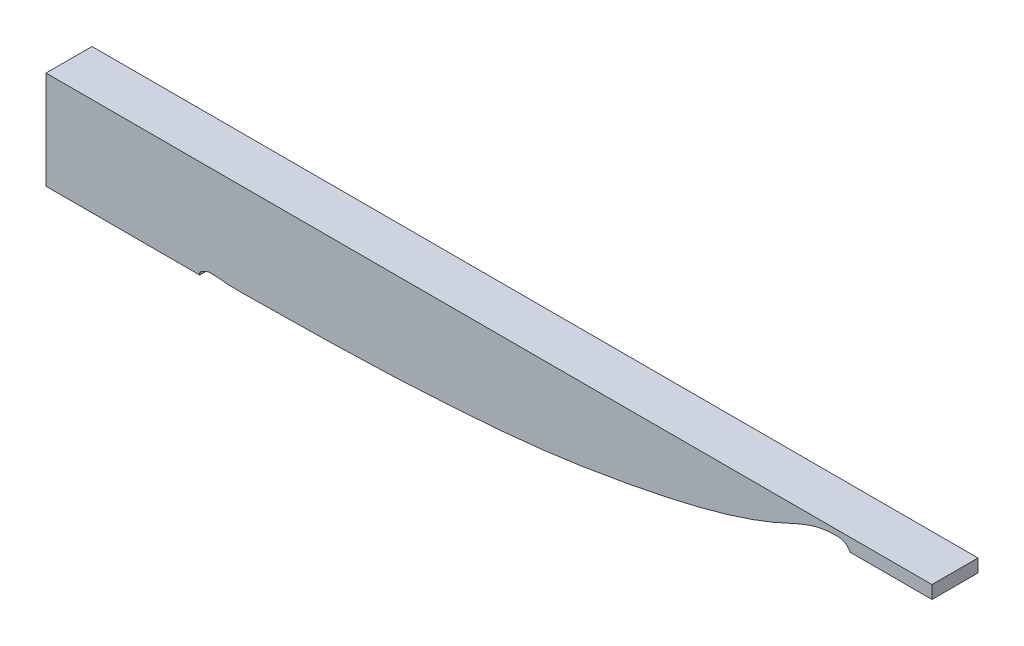
ISO-10303-21;
HEADER;
FILE_DESCRIPTION(('STEP AP214'),'2;1');
FILE_NAME('part.step','',(''),(''),'','','');
FILE_SCHEMA(('AUTOMOTIVE_DESIGN { 1 0 10303 214 1 1 1 1 }'));
ENDSEC;
DATA;
#1=APPLICATION_CONTEXT('core data for automotive mechanical design processes');
#2=APPLICATION_PROTOCOL_DEFINITION('international standard','automotive_design',2000,#1);
#3=PRODUCT_CONTEXT('',#1,'mechanical');
#4=PRODUCT('Part','Part','',(#3));
#5=PRODUCT_RELATED_PRODUCT_CATEGORY('part','',(#4));
#6=PRODUCT_DEFINITION_FORMATION('','',#4);
#7=PRODUCT_DEFINITION_CONTEXT('part definition',#1,'design');
#8=PRODUCT_DEFINITION('design','',#6,#7);
#9=PRODUCT_DEFINITION_SHAPE('','',#8);
#10=(LENGTH_UNIT() NAMED_UNIT(*) SI_UNIT(.MILLI.,.METRE.));
#11=(NAMED_UNIT(*) PLANE_ANGLE_UNIT() SI_UNIT($,.RADIAN.));
#12=(NAMED_UNIT(*) SI_UNIT($,.STERADIAN.) SOLID_ANGLE_UNIT());
#13=UNCERTAINTY_MEASURE_WITH_UNIT(LENGTH_MEASURE(1.E-05),#10,'distance_accuracy_value','');
#14=(GEOMETRIC_REPRESENTATION_CONTEXT(3) GLOBAL_UNCERTAINTY_ASSIGNED_CONTEXT((#13)) GLOBAL_UNIT_ASSIGNED_CONTEXT((#10,
#11,#12)) REPRESENTATION_CONTEXT('',''));
#15=CARTESIAN_POINT('',(0.,0.,0.));
#16=DIRECTION('',(0.,0.,1.));
#17=DIRECTION('',(1.,0.,0.));
#18=AXIS2_PLACEMENT_3D('',#15,#16,#17);
#19=CARTESIAN_POINT('',(-59.657666279957,-14.7983818950778,436.));
#20=CARTESIAN_POINT('',(-59.6661824967044,-14.7225637650633,436.));
#21=CARTESIAN_POINT('',(-59.6731821729966,-14.6464424345209,436.));
#22=CARTESIAN_POINT('',(-59.6562291061453,-14.4951804567944,436.));
#23=CARTESIAN_POINT('',(-59.6324933966375,-14.4212163839659,436.));
#24=CARTESIAN_POINT('',(-59.5533069465011,-14.2890867803336,436.));
#25=CARTESIAN_POINT('',(-59.4977093514819,-14.2360296033315,436.));
#26=CARTESIAN_POINT('',(-59.3753103715163,-14.1440991996391,436.));
#27=CARTESIAN_POINT('',(-59.3113826306846,-14.1019208228015,436.));
#28=CARTESIAN_POINT('',(-59.1206942388301,-13.9740797762433,436.));
#29=CARTESIAN_POINT('',(-58.9901551035155,-13.8949330377344,436.));
#30=CARTESIAN_POINT('',(-58.7177274775307,-13.7568564524608,436.));
#31=CARTESIAN_POINT('',(-58.5743123584874,-13.7003261136001,436.));
#32=CARTESIAN_POINT('',(-58.1387280709696,-13.5812883233373,436.));
#33=CARTESIAN_POINT('',(-57.8357742071376,-13.5583178433627,436.));
#34=CARTESIAN_POINT('',(-57.2291514129619,-13.5563095958595,436.));
#35=CARTESIAN_POINT('',(-56.9271102850682,-13.5760810992746,436.));
#36=CARTESIAN_POINT('',(-56.3238759858096,-13.6294926851283,436.));
#37=CARTESIAN_POINT('',(-56.0226169900578,-13.6632466056831,436.));
#38=CARTESIAN_POINT('',(-55.4197372457623,-13.7180837928467,436.));
#39=CARTESIAN_POINT('',(-55.1182478014107,-13.7399038018808,436.));
#40=CARTESIAN_POINT('',(-54.2136543251735,-13.791230410755,436.));
#41=CARTESIAN_POINT('',(-53.6104181856269,-13.8058170382703,436.));
#42=CARTESIAN_POINT('',(-52.4037421909577,-13.8119830676642,436.));
#43=CARTESIAN_POINT('',(-51.8003273899492,-13.8063920305854,436.));
#44=CARTESIAN_POINT('',(-50.5934932362766,-13.7946959016501,436.));
#45=CARTESIAN_POINT('',(-49.9900781459779,-13.7890721927236,436.));
#46=CARTESIAN_POINT('',(-48.1798020341631,-13.768717954905,436.));
#47=CARTESIAN_POINT('',(-46.972901588441,-13.7505978159146,436.));
#48=CARTESIAN_POINT('',(-43.3522633207156,-13.6951422810275,436.));
#49=CARTESIAN_POINT('',(-40.9385413461733,-13.6551545011908,436.));
#50=CARTESIAN_POINT('',(-36.1114185182662,-13.5592599885742,436.));
#51=CARTESIAN_POINT('',(-33.6979454175016,-13.5022666166358,436.));
#52=CARTESIAN_POINT('',(-26.4601479834471,-13.2754735365616,436.));
#53=CARTESIAN_POINT('',(-21.6385617627188,-13.0426733255743,436.));
#54=CARTESIAN_POINT('',(-14.4107967952092,-12.5892240684821,436.));
#55=CARTESIAN_POINT('',(-12.0025801478201,-12.4238190612903,436.));
#56=CARTESIAN_POINT('',(-7.19109287025892,-12.0422879975373,436.));
#57=CARTESIAN_POINT('',(-4.78783105886261,-11.8246732699985,436.));
#58=CARTESIAN_POINT('',(0.0110709006608093,-11.3069902447495,436.));
#59=CARTESIAN_POINT('',(2.40738262750726,-11.004842687982,436.));
#60=CARTESIAN_POINT('',(7.187183196596,-10.3154339469413,436.));
#61=CARTESIAN_POINT('',(9.57086414618754,-9.93041809446343,436.));
#62=CARTESIAN_POINT('',(14.3287227949183,-9.0996898920714,436.));
#63=CARTESIAN_POINT('',(16.7018448683105,-8.65423955685597,436.));
#64=CARTESIAN_POINT('',(21.4337866944255,-7.6892413541034,436.));
#65=CARTESIAN_POINT('',(23.7930063438113,-7.17165996112708,436.));
#66=CARTESIAN_POINT('',(28.4768234296212,-6.02501208290895,436.));
#67=CARTESIAN_POINT('',(30.8007851018114,-5.3895187024417,436.));
#68=CARTESIAN_POINT('',(34.2509748755813,-4.31242820861186,436.));
#69=CARTESIAN_POINT('',(35.395540325579,-3.93435318359924,436.));
#70=CARTESIAN_POINT('',(37.6701095478398,-3.12776028008755,436.));
#71=CARTESIAN_POINT('',(38.8009071175753,-2.69870898695968,436.));
#72=CARTESIAN_POINT('',(40.4769716077037,-1.99737097111651,436.));
#73=CARTESIAN_POINT('',(41.0320424398469,-1.75406256477224,436.));
#74=CARTESIAN_POINT('',(42.1383174086555,-1.25725978880647,436.));
#75=CARTESIAN_POINT('',(42.689011727176,-1.00242241482071,436.));
#76=CARTESIAN_POINT('',(44.34371118548,-0.244802896897673,436.));
#77=CARTESIAN_POINT('',(45.4516164109442,0.247705324577894,436.));
#78=CARTESIAN_POINT('',(47.1844547962418,0.799484934643336,436.));
#79=CARTESIAN_POINT('',(47.7745069590866,0.950642678502562,436.));
#80=CARTESIAN_POINT('',(48.6795691503441,1.12473595805188,436.));
#81=CARTESIAN_POINT('',(48.9854809119756,1.17433859870401,436.));
#82=CARTESIAN_POINT('',(49.5972432859825,1.25366286858455,436.));
#83=CARTESIAN_POINT('',(49.9035383225241,1.2832449666128,436.));
#84=CARTESIAN_POINT('',(50.5170436888652,1.32011557773734,436.));
#85=CARTESIAN_POINT('',(50.8242295324677,1.32800049543999,436.));
#86=CARTESIAN_POINT('',(51.2864133004525,1.30560655102121,436.));
#87=CARTESIAN_POINT('',(51.4407048348851,1.29253306455189,436.));
#88=CARTESIAN_POINT('',(51.7498388361577,1.25296715915021,436.));
#89=CARTESIAN_POINT('',(51.9029848899973,1.22611499131797,436.));
#90=CARTESIAN_POINT('',(52.2023571975027,1.14733544260008,436.));
#91=CARTESIAN_POINT('',(52.3509597754601,1.09391022953845,436.));
#92=CARTESIAN_POINT('',(52.6242409012356,0.945424266171189,436.));
#93=CARTESIAN_POINT('',(52.745073782135,0.848602720355701,436.));
#94=CARTESIAN_POINT('',(52.9682005125654,0.628989830640426,436.));
#95=CARTESIAN_POINT('',(53.0673225869701,0.508416269150171,436.));
#96=CARTESIAN_POINT('',(53.2215129528248,0.332322092235821,436.));
#97=CARTESIAN_POINT('',(53.2731655576127,0.273845425286592,436.));
#98=CARTESIAN_POINT('',(53.3650947779816,0.147046923032102,436.));
#99=CARTESIAN_POINT('',(53.4028386936198,0.0776367568421526,436.));
#100=CARTESIAN_POINT('',(53.4179538783827,0.,436.));
#101=B_SPLINE_CURVE_WITH_KNOTS('',3,(#19,#20,#21,#22,#23,#24,#25,#26,#27,#28,#29,#30,#31,#32,
#33,#34,#35,#36,#37,#38,#39,#40,#41,#42,#43,#44,#45,#46,#47,#48,#49,#50,#51,#52,#53,#54,#55,#56,
#57,#58,#59,#60,#61,#62,#63,#64,#65,#66,#67,#68,#69,#70,#71,#72,#73,#74,#75,#76,#77,#78,#79,#80,
#81,#82,#83,#84,#85,#86,#87,#88,#89,#90,#91,#92,#93,#94,#95,#96,#97,#98,#99,#100),.UNSPECIFIED.,
.F.,.F.,(4,2,2,2,2,2,2,2,2,2,2,2,2,2,2,2,2,2,2,2,2,2,2,2,2,2,2,2,2,2,2,2,2,2,2,2,2,2,2,2,4),(0.,
0.00195312499999989,0.00390624999999978,0.00585937499999967,0.00781249999999956,
0.0117187499999996,0.0156249999999994,0.0234374999999996,0.0312499999999997,0.0390624999999997,
0.0468749999999998,0.0624999999999998,0.0781249999999999,0.0937499999999999,0.125,0.1875,
0.250000000000001,0.375000000000001,0.437500000000001,0.500000000000001,0.562500000000001,
0.625000000000001,0.687500000000001,0.750000000000001,0.812500000000002,0.843750000000002,
0.875000000000002,0.890625000000002,0.906250000000002,0.937500000000001,0.953125000000001,
0.960937500000001,0.968750000000001,0.976562500000001,0.980468750000001,0.984375000000001,
0.98828125,0.9921875,0.99609375,0.998046875,1.),.UNSPECIFIED.);
#102=DIRECTION('',(0.,0.,-1.));
#103=VECTOR('',#102,1.);
#104=SURFACE_OF_LINEAR_EXTRUSION('',#101,#103);
#105=CARTESIAN_POINT('',(-59.657666279957,-14.7983818950778,428.));
#106=CARTESIAN_POINT('',(-59.6661824967044,-14.7225637650633,428.));
#107=CARTESIAN_POINT('',(-59.6731821729966,-14.6464424345209,428.));
#108=CARTESIAN_POINT('',(-59.6562291061453,-14.4951804567944,428.));
#109=CARTESIAN_POINT('',(-59.6324933966375,-14.4212163839659,428.));
#110=CARTESIAN_POINT('',(-59.5533069465011,-14.2890867803336,428.));
#111=CARTESIAN_POINT('',(-59.4977093514819,-14.2360296033315,428.));
#112=CARTESIAN_POINT('',(-59.3753103715163,-14.1440991996391,428.));
#113=CARTESIAN_POINT('',(-59.3113826306846,-14.1019208228015,428.));
#114=CARTESIAN_POINT('',(-59.1206942388301,-13.9740797762433,428.));
#115=CARTESIAN_POINT('',(-58.9901551035155,-13.8949330377344,428.));
#116=CARTESIAN_POINT('',(-58.7177274775307,-13.7568564524608,428.));
#117=CARTESIAN_POINT('',(-58.5743123584874,-13.7003261136001,428.));
#118=CARTESIAN_POINT('',(-58.1387280709696,-13.5812883233373,428.));
#119=CARTESIAN_POINT('',(-57.8357742071376,-13.5583178433627,428.));
#120=CARTESIAN_POINT('',(-57.2291514129619,-13.5563095958595,428.));
#121=CARTESIAN_POINT('',(-56.9271102850682,-13.5760810992746,428.));
#122=CARTESIAN_POINT('',(-56.3238759858096,-13.6294926851283,428.));
#123=CARTESIAN_POINT('',(-56.0226169900578,-13.6632466056831,428.));
#124=CARTESIAN_POINT('',(-55.4197372457623,-13.7180837928467,428.));
#125=CARTESIAN_POINT('',(-55.1182478014107,-13.7399038018808,428.));
#126=CARTESIAN_POINT('',(-54.2136543251735,-13.791230410755,428.));
#127=CARTESIAN_POINT('',(-53.6104181856269,-13.8058170382703,428.));
#128=CARTESIAN_POINT('',(-52.4037421909577,-13.8119830676642,428.));
#129=CARTESIAN_POINT('',(-51.8003273899492,-13.8063920305854,428.));
#130=CARTESIAN_POINT('',(-50.5934932362766,-13.7946959016501,428.));
#131=CARTESIAN_POINT('',(-49.9900781459779,-13.7890721927236,428.));
#132=CARTESIAN_POINT('',(-48.1798020341631,-13.768717954905,428.));
#133=CARTESIAN_POINT('',(-46.972901588441,-13.7505978159146,428.));
#134=CARTESIAN_POINT('',(-43.3522633207156,-13.6951422810275,428.));
#135=CARTESIAN_POINT('',(-40.9385413461733,-13.6551545011908,428.));
#136=CARTESIAN_POINT('',(-36.1114185182662,-13.5592599885742,428.));
#137=CARTESIAN_POINT('',(-33.6979454175016,-13.5022666166358,428.));
#138=CARTESIAN_POINT('',(-26.4601479834471,-13.2754735365616,428.));
#139=CARTESIAN_POINT('',(-21.6385617627188,-13.0426733255743,428.));
#140=CARTESIAN_POINT('',(-14.4107967952092,-12.5892240684821,428.));
#141=CARTESIAN_POINT('',(-12.0025801478201,-12.4238190612903,428.));
#142=CARTESIAN_POINT('',(-7.19109287025892,-12.0422879975373,428.));
#143=CARTESIAN_POINT('',(-4.78783105886261,-11.8246732699985,428.));
#144=CARTESIAN_POINT('',(0.0110709006608093,-11.3069902447495,428.));
#145=CARTESIAN_POINT('',(2.40738262750726,-11.004842687982,428.));
#146=CARTESIAN_POINT('',(7.187183196596,-10.3154339469413,428.));
#147=CARTESIAN_POINT('',(9.57086414618754,-9.93041809446343,428.));
#148=CARTESIAN_POINT('',(14.3287227949183,-9.0996898920714,428.));
#149=CARTESIAN_POINT('',(16.7018448683105,-8.65423955685597,428.));
#150=CARTESIAN_POINT('',(21.4337866944255,-7.6892413541034,428.));
#151=CARTESIAN_POINT('',(23.7930063438113,-7.17165996112708,428.));
#152=CARTESIAN_POINT('',(28.4768234296212,-6.02501208290895,428.));
#153=CARTESIAN_POINT('',(30.8007851018114,-5.3895187024417,428.));
#154=CARTESIAN_POINT('',(34.2509748755813,-4.31242820861186,428.));
#155=CARTESIAN_POINT('',(35.395540325579,-3.93435318359924,428.));
#156=CARTESIAN_POINT('',(37.6701095478398,-3.12776028008755,428.));
#157=CARTESIAN_POINT('',(38.8009071175753,-2.69870898695968,428.));
#158=CARTESIAN_POINT('',(40.4769716077037,-1.99737097111651,428.));
#159=CARTESIAN_POINT('',(41.0320424398469,-1.75406256477224,428.));
#160=CARTESIAN_POINT('',(42.1383174086555,-1.25725978880647,428.));
#161=CARTESIAN_POINT('',(42.689011727176,-1.00242241482071,428.));
#162=CARTESIAN_POINT('',(44.34371118548,-0.244802896897673,428.));
#163=CARTESIAN_POINT('',(45.4516164109442,0.247705324577894,428.));
#164=CARTESIAN_POINT('',(47.1844547962418,0.799484934643336,428.));
#165=CARTESIAN_POINT('',(47.7745069590866,0.950642678502562,428.));
#166=CARTESIAN_POINT('',(48.6795691503441,1.12473595805188,428.));
#167=CARTESIAN_POINT('',(48.9854809119756,1.17433859870401,428.));
#168=CARTESIAN_POINT('',(49.5972432859825,1.25366286858455,428.));
#169=CARTESIAN_POINT('',(49.9035383225241,1.2832449666128,428.));
#170=CARTESIAN_POINT('',(50.5170436888652,1.32011557773734,428.));
#171=CARTESIAN_POINT('',(50.8242295324677,1.32800049543999,428.));
#172=CARTESIAN_POINT('',(51.2864133004525,1.30560655102121,428.));
#173=CARTESIAN_POINT('',(51.4407048348851,1.29253306455189,428.));
#174=CARTESIAN_POINT('',(51.7498388361577,1.25296715915021,428.));
#175=CARTESIAN_POINT('',(51.9029848899973,1.22611499131797,428.));
#176=CARTESIAN_POINT('',(52.2023571975027,1.14733544260008,428.));
#177=CARTESIAN_POINT('',(52.3509597754601,1.09391022953845,428.));
#178=CARTESIAN_POINT('',(52.6242409012356,0.945424266171189,428.));
#179=CARTESIAN_POINT('',(52.745073782135,0.848602720355701,428.));
#180=CARTESIAN_POINT('',(52.9682005125654,0.628989830640426,428.));
#181=CARTESIAN_POINT('',(53.0673225869701,0.508416269150171,428.));
#182=CARTESIAN_POINT('',(53.2215129528248,0.332322092235821,428.));
#183=CARTESIAN_POINT('',(53.2731655576127,0.273845425286592,428.));
#184=CARTESIAN_POINT('',(53.3650947779816,0.147046923032102,428.));
#185=CARTESIAN_POINT('',(53.4028386936198,0.0776367568421526,428.));
#186=CARTESIAN_POINT('',(53.4179538783827,0.,428.));
#187=B_SPLINE_CURVE_WITH_KNOTS('',3,(#105,#106,#107,#108,#109,#110,#111,#112,#113,#114,#115,
#116,#117,#118,#119,#120,#121,#122,#123,#124,#125,#126,#127,#128,#129,#130,#131,#132,#133,#134,
#135,#136,#137,#138,#139,#140,#141,#142,#143,#144,#145,#146,#147,#148,#149,#150,#151,#152,#153,
#154,#155,#156,#157,#158,#159,#160,#161,#162,#163,#164,#165,#166,#167,#168,#169,#170,#171,#172,
#173,#174,#175,#176,#177,#178,#179,#180,#181,#182,#183,#184,#185,#186),.UNSPECIFIED.,.F.,.F.,(4,
2,2,2,2,2,2,2,2,2,2,2,2,2,2,2,2,2,2,2,2,2,2,2,2,2,2,2,2,2,2,2,2,2,2,2,2,2,2,2,4),(0.,
0.00195312499999989,0.00390624999999978,0.00585937499999967,0.00781249999999956,
0.0117187499999996,0.0156249999999994,0.0234374999999996,0.0312499999999997,0.0390624999999997,
0.0468749999999998,0.0624999999999998,0.0781249999999999,0.0937499999999999,0.125,0.1875,
0.250000000000001,0.375000000000001,0.437500000000001,0.500000000000001,0.562500000000001,
0.625000000000001,0.687500000000001,0.750000000000001,0.812500000000002,0.843750000000002,
0.875000000000002,0.890625000000002,0.906250000000002,0.937500000000001,0.953125000000001,
0.960937500000001,0.968750000000001,0.976562500000001,0.980468750000001,0.984375000000001,
0.98828125,0.9921875,0.99609375,0.998046875,1.),.UNSPECIFIED.);
#188=CARTESIAN_POINT('',(-59.6576662799527,-14.7983818950774,428.));
#189=VERTEX_POINT('',#188);
#190=CARTESIAN_POINT('',(53.4179538783827,0.,428.));
#191=VERTEX_POINT('',#190);
#192=EDGE_CURVE('E165',#189,#191,#187,.T.);
#193=ORIENTED_EDGE('',*,*,#192,.T.);
#194=DIRECTION('',(0.,0.,-1.));
#195=VECTOR('',#194,1.);
#196=CARTESIAN_POINT('',(53.4179538783827,0.,436.));
#197=LINE('',#196,#195);
#198=CARTESIAN_POINT('',(53.4179538783827,0.,436.));
#199=VERTEX_POINT('',#198);
#200=EDGE_CURVE('E11',#199,#191,#197,.T.);
#201=ORIENTED_EDGE('',*,*,#200,.F.);
#202=CARTESIAN_POINT('',(53.4179538783827,0.,436.));
#203=CARTESIAN_POINT('',(53.4028386936198,0.0776367568421526,436.));
#204=CARTESIAN_POINT('',(53.3650947779816,0.147046923032102,436.));
#205=CARTESIAN_POINT('',(53.2731655576127,0.273845425286592,436.));
#206=CARTESIAN_POINT('',(53.2215129528248,0.332322092235821,436.));
#207=CARTESIAN_POINT('',(53.0673225869701,0.508416269150171,436.));
#208=CARTESIAN_POINT('',(52.9682005125654,0.628989830640426,436.));
#209=CARTESIAN_POINT('',(52.745073782135,0.848602720355701,436.));
#210=CARTESIAN_POINT('',(52.6242409012356,0.945424266171189,436.));
#211=CARTESIAN_POINT('',(52.3509597754601,1.09391022953845,436.));
#212=CARTESIAN_POINT('',(52.2023571975027,1.14733544260008,436.));
#213=CARTESIAN_POINT('',(51.9029848899973,1.22611499131797,436.));
#214=CARTESIAN_POINT('',(51.7498388361577,1.25296715915021,436.));
#215=CARTESIAN_POINT('',(51.4407048348851,1.29253306455189,436.));
#216=CARTESIAN_POINT('',(51.2864133004525,1.30560655102121,436.));
#217=CARTESIAN_POINT('',(50.8242295324677,1.32800049543999,436.));
#218=CARTESIAN_POINT('',(50.5170436888652,1.32011557773734,436.));
#219=CARTESIAN_POINT('',(49.9035383225241,1.2832449666128,436.));
#220=CARTESIAN_POINT('',(49.5972432859825,1.25366286858455,436.));
#221=CARTESIAN_POINT('',(48.9854809119756,1.17433859870401,436.));
#222=CARTESIAN_POINT('',(48.6795691503441,1.12473595805188,436.));
#223=CARTESIAN_POINT('',(47.7745069590866,0.950642678502562,436.));
#224=CARTESIAN_POINT('',(47.1844547962418,0.799484934643336,436.));
#225=CARTESIAN_POINT('',(45.4516164109442,0.247705324577894,436.));
#226=CARTESIAN_POINT('',(44.34371118548,-0.244802896897673,436.));
#227=CARTESIAN_POINT('',(42.689011727176,-1.00242241482071,436.));
#228=CARTESIAN_POINT('',(42.1383174086555,-1.25725978880647,436.));
#229=CARTESIAN_POINT('',(41.0320424398469,-1.75406256477224,436.));
#230=CARTESIAN_POINT('',(40.4769716077037,-1.99737097111651,436.));
#231=CARTESIAN_POINT('',(38.8009071175753,-2.69870898695968,436.));
#232=CARTESIAN_POINT('',(37.6701095478398,-3.12776028008755,436.));
#233=CARTESIAN_POINT('',(35.395540325579,-3.93435318359924,436.));
#234=CARTESIAN_POINT('',(34.2509748755813,-4.31242820861186,436.));
#235=CARTESIAN_POINT('',(30.8007851018114,-5.3895187024417,436.));
#236=CARTESIAN_POINT('',(28.4768234296212,-6.02501208290895,436.));
#237=CARTESIAN_POINT('',(23.7930063438113,-7.17165996112708,436.));
#238=CARTESIAN_POINT('',(21.4337866944255,-7.6892413541034,436.));
#239=CARTESIAN_POINT('',(16.7018448683105,-8.65423955685597,436.));
#240=CARTESIAN_POINT('',(14.3287227949183,-9.0996898920714,436.));
#241=CARTESIAN_POINT('',(9.57086414618754,-9.93041809446343,436.));
#242=CARTESIAN_POINT('',(7.187183196596,-10.3154339469413,436.));
#243=CARTESIAN_POINT('',(2.40738262750726,-11.004842687982,436.));
#244=CARTESIAN_POINT('',(0.0110709006608093,-11.3069902447495,436.));
#245=CARTESIAN_POINT('',(-4.78783105886261,-11.8246732699985,436.));
#246=CARTESIAN_POINT('',(-7.19109287025892,-12.0422879975373,436.));
#247=CARTESIAN_POINT('',(-12.0025801478201,-12.4238190612903,436.));
#248=CARTESIAN_POINT('',(-14.4107967952092,-12.5892240684821,436.));
#249=CARTESIAN_POINT('',(-21.6385617627188,-13.0426733255743,436.));
#250=CARTESIAN_POINT('',(-26.4601479834471,-13.2754735365616,436.));
#251=CARTESIAN_POINT('',(-33.6979454175016,-13.5022666166358,436.));
#252=CARTESIAN_POINT('',(-36.1114185182662,-13.5592599885742,436.));
#253=CARTESIAN_POINT('',(-40.9385413461733,-13.6551545011908,436.));
#254=CARTESIAN_POINT('',(-43.3522633207156,-13.6951422810275,436.));
#255=CARTESIAN_POINT('',(-46.972901588441,-13.7505978159146,436.));
#256=CARTESIAN_POINT('',(-48.1798020341631,-13.768717954905,436.));
#257=CARTESIAN_POINT('',(-49.9900781459779,-13.7890721927236,436.));
#258=CARTESIAN_POINT('',(-50.5934932362766,-13.7946959016501,436.));
#259=CARTESIAN_POINT('',(-51.8003273899492,-13.8063920305854,436.));
#260=CARTESIAN_POINT('',(-52.4037421909577,-13.8119830676642,436.));
#261=CARTESIAN_POINT('',(-53.6104181856269,-13.8058170382703,436.));
#262=CARTESIAN_POINT('',(-54.2136543251735,-13.791230410755,436.));
#263=CARTESIAN_POINT('',(-55.1182478014107,-13.7399038018808,436.));
#264=CARTESIAN_POINT('',(-55.4197372457623,-13.7180837928467,436.));
#265=CARTESIAN_POINT('',(-56.0226169900578,-13.6632466056831,436.));
#266=CARTESIAN_POINT('',(-56.3238759858096,-13.6294926851283,436.));
#267=CARTESIAN_POINT('',(-56.9271102850682,-13.5760810992746,436.));
#268=CARTESIAN_POINT('',(-57.2291514129619,-13.5563095958595,436.));
#269=CARTESIAN_POINT('',(-57.8357742071376,-13.5583178433627,436.));
#270=CARTESIAN_POINT('',(-58.1387280709696,-13.5812883233373,436.));
#271=CARTESIAN_POINT('',(-58.5743123584874,-13.7003261136001,436.));
#272=CARTESIAN_POINT('',(-58.7177274775307,-13.7568564524608,436.));
#273=CARTESIAN_POINT('',(-58.9901551035155,-13.8949330377344,436.));
#274=CARTESIAN_POINT('',(-59.1206942388301,-13.9740797762433,436.));
#275=CARTESIAN_POINT('',(-59.3113826306846,-14.1019208228015,436.));
#276=CARTESIAN_POINT('',(-59.3753103715163,-14.1440991996391,436.));
#277=CARTESIAN_POINT('',(-59.4977093514819,-14.2360296033315,436.));
#278=CARTESIAN_POINT('',(-59.5533069465011,-14.2890867803336,436.));
#279=CARTESIAN_POINT('',(-59.6324933966375,-14.4212163839659,436.));
#280=CARTESIAN_POINT('',(-59.6562291061453,-14.4951804567944,436.));
#281=CARTESIAN_POINT('',(-59.6731821729966,-14.6464424345209,436.));
#282=CARTESIAN_POINT('',(-59.6661824967044,-14.7225637650633,436.));
#283=CARTESIAN_POINT('',(-59.657666279957,-14.7983818950778,436.));
#284=B_SPLINE_CURVE_WITH_KNOTS('',3,(#202,#203,#204,#205,#206,#207,#208,#209,#210,#211,#212,
#213,#214,#215,#216,#217,#218,#219,#220,#221,#222,#223,#224,#225,#226,#227,#228,#229,#230,#231,
#232,#233,#234,#235,#236,#237,#238,#239,#240,#241,#242,#243,#244,#245,#246,#247,#248,#249,#250,
#251,#252,#253,#254,#255,#256,#257,#258,#259,#260,#261,#262,#263,#264,#265,#266,#267,#268,#269,
#270,#271,#272,#273,#274,#275,#276,#277,#278,#279,#280,#281,#282,#283),.UNSPECIFIED.,.F.,.F.,(4,
2,2,2,2,2,2,2,2,2,2,2,2,2,2,2,2,2,2,2,2,2,2,2,2,2,2,2,2,2,2,2,2,2,2,2,2,2,2,2,4),(0.,
0.00195312499999989,0.00390624999999978,0.00781249999999967,0.0117187499999996,
0.0156249999999993,0.0195312499999992,0.0234374999999991,0.0312499999999991,0.039062499999999,
0.0468749999999989,0.0624999999999988,0.0937499999999984,0.109374999999998,0.124999999999998,
0.156249999999998,0.187499999999998,0.249999999999999,0.312499999999999,0.374999999999999,
0.437499999999999,0.499999999999999,0.562499999999999,0.624999999999999,0.749999999999999,
0.8125,0.875,0.90625,0.921875,0.9375,0.953125,0.9609375,0.96875,0.9765625,0.984375000000001,
0.98828125,0.9921875,0.994140625,0.99609375,0.998046875,1.),.UNSPECIFIED.);
#285=CARTESIAN_POINT('',(-59.6576662799527,-14.7983818950774,436.));
#286=VERTEX_POINT('',#285);
#287=EDGE_CURVE('E129',#286,#199,#284,.F.);
#288=ORIENTED_EDGE('',*,*,#287,.F.);
#289=DIRECTION('',(0.,0.,-1.));
#290=VECTOR('',#289,1.);
#291=CARTESIAN_POINT('',(-59.6576662799527,-14.7983818950774,436.));
#292=LINE('',#291,#290);
#293=EDGE_CURVE('E114',#286,#189,#292,.T.);
#294=ORIENTED_EDGE('',*,*,#293,.T.);
#295=EDGE_LOOP('',(#193,#201,#288,#294));
#296=FACE_BOUND('',#295,.T.);
#297=ADVANCED_FACE('F30',(#296),#104,.F.);
#298=CARTESIAN_POINT('',(53.4179538783827,0.,436.));
#299=DIRECTION('',(0.,1.,0.));
#300=DIRECTION('',(-1.,0.,0.));
#301=AXIS2_PLACEMENT_3D('',#298,#299,#300);
#302=PLANE('',#301);
#303=DIRECTION('',(1.,0.,0.));
#304=VECTOR('',#303,1.);
#305=CARTESIAN_POINT('',(53.4179538783827,0.,428.));
#306=LINE('',#305,#304);
#307=CARTESIAN_POINT('',(67.6623663766938,0.,428.));
#308=VERTEX_POINT('',#307);
#309=EDGE_CURVE('E120',#191,#308,#306,.T.);
#310=ORIENTED_EDGE('',*,*,#309,.T.);
#311=DIRECTION('',(0.,0.,-1.));
#312=VECTOR('',#311,1.);
#313=CARTESIAN_POINT('',(67.6623663766938,0.,436.));
#314=LINE('',#313,#312);
#315=CARTESIAN_POINT('',(67.6623663766938,0.,436.));
#316=VERTEX_POINT('',#315);
#317=EDGE_CURVE('E41',#316,#308,#314,.T.);
#318=ORIENTED_EDGE('',*,*,#317,.F.);
#319=DIRECTION('',(1.,0.,0.));
#320=VECTOR('',#319,1.);
#321=CARTESIAN_POINT('',(53.4179538783827,0.,436.));
#322=LINE('',#321,#320);
#323=EDGE_CURVE('E87',#199,#316,#322,.T.);
#324=ORIENTED_EDGE('',*,*,#323,.F.);
#325=ORIENTED_EDGE('',*,*,#200,.T.);
#326=EDGE_LOOP('',(#310,#318,#324,#325));
#327=FACE_BOUND('',#326,.T.);
#328=ADVANCED_FACE('F199',(#327),#302,.F.);
#329=CARTESIAN_POINT('',(67.6623663766938,2.25600000000005,436.));
#330=DIRECTION('',(-1.,0.,0.));
#331=DIRECTION('',(0.,-1.,0.));
#332=AXIS2_PLACEMENT_3D('',#329,#330,#331);
#333=PLANE('',#332);
#334=DIRECTION('',(0.,1.,0.));
#335=VECTOR('',#334,1.);
#336=CARTESIAN_POINT('',(67.6623663766938,2.25600000000005,428.));
#337=LINE('',#336,#335);
#338=CARTESIAN_POINT('',(67.6623663766938,2.25600000000005,428.));
#339=VERTEX_POINT('',#338);
#340=EDGE_CURVE('E118',#308,#339,#337,.T.);
#341=ORIENTED_EDGE('',*,*,#340,.T.);
#342=DIRECTION('',(0.,0.,-1.));
#343=VECTOR('',#342,1.);
#344=CARTESIAN_POINT('',(67.6623663766938,2.25600000000005,436.));
#345=LINE('',#344,#343);
#346=CARTESIAN_POINT('',(67.6623663766938,2.25600000000005,436.));
#347=VERTEX_POINT('',#346);
#348=EDGE_CURVE('E109',#347,#339,#345,.T.);
#349=ORIENTED_EDGE('',*,*,#348,.F.);
#350=DIRECTION('',(0.,1.,0.));
#351=VECTOR('',#350,1.);
#352=CARTESIAN_POINT('',(67.6623663766938,2.25600000000005,436.));
#353=LINE('',#352,#351);
#354=EDGE_CURVE('E100',#316,#347,#353,.T.);
#355=ORIENTED_EDGE('',*,*,#354,.F.);
#356=ORIENTED_EDGE('',*,*,#317,.T.);
#357=EDGE_LOOP('',(#341,#349,#355,#356));
#358=FACE_BOUND('',#357,.T.);
#359=ADVANCED_FACE('F202',(#358),#333,.F.);
#360=CARTESIAN_POINT('',(67.6623663766938,2.25600000000005,436.));
#361=DIRECTION('',(0.,-1.,0.));
#362=DIRECTION('',(1.,0.,0.));
#363=AXIS2_PLACEMENT_3D('',#360,#361,#362);
#364=PLANE('',#363);
#365=DIRECTION('',(-1.,0.,0.));
#366=VECTOR('',#365,1.);
#367=CARTESIAN_POINT('',(67.6623663766938,2.25600000000005,428.));
#368=LINE('',#367,#366);
#369=CARTESIAN_POINT('',(-86.3779907713208,2.25600000000003,428.));
#370=VERTEX_POINT('',#369);
#371=EDGE_CURVE('E108',#339,#370,#368,.T.);
#372=ORIENTED_EDGE('',*,*,#371,.T.);
#373=DIRECTION('',(0.,0.,-1.));
#374=VECTOR('',#373,1.);
#375=CARTESIAN_POINT('',(-86.3779907713208,2.25600000000003,436.));
#376=LINE('',#375,#374);
#377=CARTESIAN_POINT('',(-86.3779907713208,2.25600000000003,436.));
#378=VERTEX_POINT('',#377);
#379=EDGE_CURVE('E105',#378,#370,#376,.T.);
#380=ORIENTED_EDGE('',*,*,#379,.F.);
#381=DIRECTION('',(-1.,0.,0.));
#382=VECTOR('',#381,1.);
#383=CARTESIAN_POINT('',(67.6623663766938,2.25600000000005,436.));
#384=LINE('',#383,#382);
#385=EDGE_CURVE('E94',#347,#378,#384,.T.);
#386=ORIENTED_EDGE('',*,*,#385,.F.);
#387=ORIENTED_EDGE('',*,*,#348,.T.);
#388=EDGE_LOOP('',(#372,#380,#386,#387));
#389=FACE_BOUND('',#388,.T.);
#390=ADVANCED_FACE('F106',(#389),#364,.F.);
#391=CARTESIAN_POINT('',(-86.3779907713207,-14.7984376852184,436.));
#392=DIRECTION('',(1.,0.,0.));
#393=DIRECTION('',(0.,1.,0.));
#394=AXIS2_PLACEMENT_3D('',#391,#392,#393);
#395=PLANE('',#394);
#396=DIRECTION('',(0.,-1.,0.));
#397=VECTOR('',#396,1.);
#398=CARTESIAN_POINT('',(-86.3779907713207,-14.7984376852184,428.));
#399=LINE('',#398,#397);
#400=CARTESIAN_POINT('',(-86.3779907713207,-14.7984376852184,428.));
#401=VERTEX_POINT('',#400);
#402=EDGE_CURVE('E73',#370,#401,#399,.T.);
#403=ORIENTED_EDGE('',*,*,#402,.T.);
#404=DIRECTION('',(0.,0.,-1.));
#405=VECTOR('',#404,1.);
#406=CARTESIAN_POINT('',(-86.3779907713207,-14.7984376852184,436.));
#407=LINE('',#406,#405);
#408=CARTESIAN_POINT('',(-86.3779907713207,-14.7984376852184,436.));
#409=VERTEX_POINT('',#408);
#410=EDGE_CURVE('E110',#409,#401,#407,.T.);
#411=ORIENTED_EDGE('',*,*,#410,.F.);
#412=DIRECTION('',(0.,-1.,0.));
#413=VECTOR('',#412,1.);
#414=CARTESIAN_POINT('',(-86.3779907713207,-14.7984376852184,436.));
#415=LINE('',#414,#413);
#416=EDGE_CURVE('E98',#378,#409,#415,.T.);
#417=ORIENTED_EDGE('',*,*,#416,.F.);
#418=ORIENTED_EDGE('',*,*,#379,.T.);
#419=EDGE_LOOP('',(#403,#411,#417,#418));
#420=FACE_BOUND('',#419,.T.);
#421=ADVANCED_FACE('F112',(#420),#395,.F.);
#422=CARTESIAN_POINT('',(-86.3779907713207,-14.7984376852184,436.));
#423=DIRECTION('',(-2.08792902491366E-06,0.99999999999782,0.));
#424=DIRECTION('',(-0.99999999999782,-2.08792902491366E-06,0.));
#425=AXIS2_PLACEMENT_3D('',#422,#423,#424);
#426=PLANE('',#425);
#427=DIRECTION('',(0.99999999999782,2.08792902491366E-06,0.));
#428=VECTOR('',#427,1.);
#429=CARTESIAN_POINT('',(-86.3779907713207,-14.7984376852184,428.));
#430=LINE('',#429,#428);
#431=EDGE_CURVE('E79',#401,#189,#430,.T.);
#432=ORIENTED_EDGE('',*,*,#431,.T.);
#433=ORIENTED_EDGE('',*,*,#293,.F.);
#434=DIRECTION('',(0.99999999999782,2.08792902491366E-06,0.));
#435=VECTOR('',#434,1.);
#436=CARTESIAN_POINT('',(-86.3779907713207,-14.7984376852184,436.));
#437=LINE('',#436,#435);
#438=EDGE_CURVE('E50',#409,#286,#437,.T.);
#439=ORIENTED_EDGE('',*,*,#438,.F.);
#440=ORIENTED_EDGE('',*,*,#410,.T.);
#441=EDGE_LOOP('',(#432,#433,#439,#440));
#442=FACE_BOUND('',#441,.T.);
#443=ADVANCED_FACE('F145',(#442),#426,.F.);
#444=CARTESIAN_POINT('',(-2.38838007910102,-11.565831757374,436.));
#445=DIRECTION('',(0.,0.,-1.));
#446=DIRECTION('',(-1.,0.,0.));
#447=AXIS2_PLACEMENT_3D('',#444,#445,#446);
#448=PLANE('',#447);
#449=ORIENTED_EDGE('',*,*,#287,.T.);
#450=ORIENTED_EDGE('',*,*,#323,.T.);
#451=ORIENTED_EDGE('',*,*,#354,.T.);
#452=ORIENTED_EDGE('',*,*,#385,.T.);
#453=ORIENTED_EDGE('',*,*,#416,.T.);
#454=ORIENTED_EDGE('',*,*,#438,.T.);
#455=EDGE_LOOP('',(#449,#450,#451,#452,#453,#454));
#456=FACE_BOUND('',#455,.T.);
#457=ADVANCED_FACE('F96',(#456),#448,.F.);
#458=CARTESIAN_POINT('',(-2.38838007910102,-11.565831757374,428.));
#459=DIRECTION('',(0.,0.,-1.));
#460=DIRECTION('',(-1.,0.,0.));
#461=AXIS2_PLACEMENT_3D('',#458,#459,#460);
#462=PLANE('',#461);
#463=ORIENTED_EDGE('',*,*,#192,.F.);
#464=ORIENTED_EDGE('',*,*,#431,.F.);
#465=ORIENTED_EDGE('',*,*,#402,.F.);
#466=ORIENTED_EDGE('',*,*,#371,.F.);
#467=ORIENTED_EDGE('',*,*,#340,.F.);
#468=ORIENTED_EDGE('',*,*,#309,.F.);
#469=EDGE_LOOP('',(#463,#464,#465,#466,#467,#468));
#470=FACE_BOUND('',#469,.T.);
#471=ADVANCED_FACE('F144',(#470),#462,.T.);
#472=CLOSED_SHELL('',(#297,#328,#359,#390,#421,#443,#457,#471));
#473=MANIFOLD_SOLID_BREP('B2',#472);
#474=ADVANCED_BREP_SHAPE_REPRESENTATION('',(#18,#473),#14);
#475=SHAPE_DEFINITION_REPRESENTATION(#9,#474);
ENDSEC;
END-ISO-10303-21;
